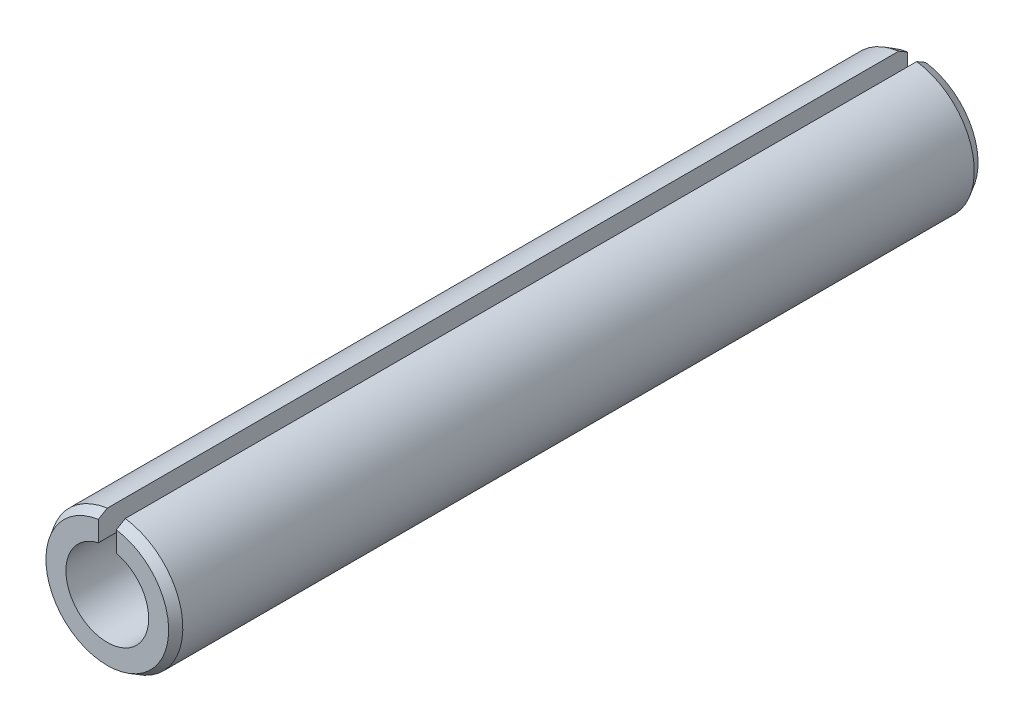
ISO-10303-21;
HEADER;
FILE_DESCRIPTION(('STEP AP214'),'2;1');
FILE_NAME('part.step','',(''),(''),'','','');
FILE_SCHEMA(('AUTOMOTIVE_DESIGN { 1 0 10303 214 1 1 1 1 }'));
ENDSEC;
DATA;
#1=APPLICATION_CONTEXT('core data for automotive mechanical design processes');
#2=APPLICATION_PROTOCOL_DEFINITION('international standard','automotive_design',2000,#1);
#3=PRODUCT_CONTEXT('',#1,'mechanical');
#4=PRODUCT('Part','Part','',(#3));
#5=PRODUCT_RELATED_PRODUCT_CATEGORY('part','',(#4));
#6=PRODUCT_DEFINITION_FORMATION('','',#4);
#7=PRODUCT_DEFINITION_CONTEXT('part definition',#1,'design');
#8=PRODUCT_DEFINITION('design','',#6,#7);
#9=PRODUCT_DEFINITION_SHAPE('','',#8);
#10=(LENGTH_UNIT() NAMED_UNIT(*) SI_UNIT(.MILLI.,.METRE.));
#11=(NAMED_UNIT(*) PLANE_ANGLE_UNIT() SI_UNIT($,.RADIAN.));
#12=(NAMED_UNIT(*) SI_UNIT($,.STERADIAN.) SOLID_ANGLE_UNIT());
#13=UNCERTAINTY_MEASURE_WITH_UNIT(LENGTH_MEASURE(1.E-05),#10,'distance_accuracy_value','');
#14=(GEOMETRIC_REPRESENTATION_CONTEXT(3) GLOBAL_UNCERTAINTY_ASSIGNED_CONTEXT((#13)) GLOBAL_UNIT_ASSIGNED_CONTEXT((#10,
#11,#12)) REPRESENTATION_CONTEXT('',''));
#15=CARTESIAN_POINT('',(0.,0.,0.));
#16=DIRECTION('',(0.,0.,1.));
#17=DIRECTION('',(1.,0.,0.));
#18=AXIS2_PLACEMENT_3D('',#15,#16,#17);
#19=CARTESIAN_POINT('',(0.,0.,45.));
#20=DIRECTION('',(0.,0.,-1.));
#21=DIRECTION('',(-1.,0.,0.));
#22=AXIS2_PLACEMENT_3D('',#19,#20,#21);
#23=CYLINDRICAL_SURFACE('',#22,2.3);
#24=CARTESIAN_POINT('',(0.,0.,0.));
#25=DIRECTION('',(0.,0.,-1.));
#26=DIRECTION('',(1.,0.,0.));
#27=AXIS2_PLACEMENT_3D('',#24,#25,#26);
#28=CIRCLE('',#27,2.3);
#29=CARTESIAN_POINT('',(0.499999999999999,2.24499443206436,0.));
#30=VERTEX_POINT('',#29);
#31=CARTESIAN_POINT('',(-0.5,2.24499443206436,0.));
#32=VERTEX_POINT('',#31);
#33=EDGE_CURVE('E89',#30,#32,#28,.T.);
#34=ORIENTED_EDGE('',*,*,#33,.T.);
#35=DIRECTION('',(0.,0.,-1.));
#36=VECTOR('',#35,1.);
#37=CARTESIAN_POINT('',(-0.5,2.24499443206436,45.));
#38=LINE('',#37,#36);
#39=CARTESIAN_POINT('',(-0.5,2.24499443206436,45.));
#40=VERTEX_POINT('',#39);
#41=EDGE_CURVE('E94',#40,#32,#38,.T.);
#42=ORIENTED_EDGE('',*,*,#41,.F.);
#43=CARTESIAN_POINT('',(0.,0.,45.));
#44=DIRECTION('',(0.,0.,-1.));
#45=DIRECTION('',(1.,0.,0.));
#46=AXIS2_PLACEMENT_3D('',#43,#44,#45);
#47=CIRCLE('',#46,2.3);
#48=CARTESIAN_POINT('',(0.499999999999999,2.24499443206436,45.));
#49=VERTEX_POINT('',#48);
#50=EDGE_CURVE('E109',#49,#40,#47,.T.);
#51=ORIENTED_EDGE('',*,*,#50,.F.);
#52=DIRECTION('',(0.,0.,-1.));
#53=VECTOR('',#52,1.);
#54=CARTESIAN_POINT('',(0.499999999999999,2.24499443206436,45.));
#55=LINE('',#54,#53);
#56=EDGE_CURVE('E105',#49,#30,#55,.T.);
#57=ORIENTED_EDGE('',*,*,#56,.T.);
#58=EDGE_LOOP('',(#34,#42,#51,#57));
#59=FACE_BOUND('',#58,.T.);
#60=ADVANCED_FACE('F33',(#59),#23,.F.);
#61=CARTESIAN_POINT('',(-0.5,3.66606055596467,45.));
#62=DIRECTION('',(-1.,0.,0.));
#63=DIRECTION('',(0.,-1.,0.));
#64=AXIS2_PLACEMENT_3D('',#61,#62,#63);
#65=PLANE('',#64);
#66=DIRECTION('',(0.,1.,0.));
#67=VECTOR('',#66,1.);
#68=CARTESIAN_POINT('',(-0.5,3.66606055596467,0.));
#69=LINE('',#68,#67);
#70=CARTESIAN_POINT('',(-0.5,3.37448326967725,0.));
#71=VERTEX_POINT('',#70);
#72=EDGE_CURVE('E85',#32,#71,#69,.T.);
#73=ORIENTED_EDGE('',*,*,#72,.T.);
#74=CARTESIAN_POINT('',(-0.5,3.37448326967725,0.));
#75=CARTESIAN_POINT('',(-0.5,3.42310923162932,0.0833159860457954));
#76=CARTESIAN_POINT('',(-0.5,3.47172031982738,0.166640645789255));
#77=CARTESIAN_POINT('',(-0.5,3.56891274858977,0.333307312455967));
#78=CARTESIAN_POINT('',(-0.5,3.61749408915419,0.416649319379174));
#79=CARTESIAN_POINT('',(-0.5,3.66606055596467,0.5));
#80=B_SPLINE_CURVE_WITH_KNOTS('',3,(#74,#75,#76,#77,#78,#79),.UNSPECIFIED.,.F.,.F.,(4,2,4),(0.,
0.289403405913722,0.578806811078924),.UNSPECIFIED.);
#81=CARTESIAN_POINT('',(-0.500000000000001,3.66606055596467,0.5));
#82=VERTEX_POINT('',#81);
#83=EDGE_CURVE('E40',#71,#82,#80,.T.);
#84=ORIENTED_EDGE('',*,*,#83,.T.);
#85=DIRECTION('',(0.,0.,-1.));
#86=VECTOR('',#85,1.);
#87=CARTESIAN_POINT('',(-0.500000000000001,3.66606055596467,45.));
#88=LINE('',#87,#86);
#89=CARTESIAN_POINT('',(-0.500000000000001,3.66606055596467,44.5));
#90=VERTEX_POINT('',#89);
#91=EDGE_CURVE('E101',#90,#82,#88,.T.);
#92=ORIENTED_EDGE('',*,*,#91,.F.);
#93=CARTESIAN_POINT('',(-0.500000000000001,3.66606055596467,44.5));
#94=CARTESIAN_POINT('',(-0.500000000000001,3.61749408915419,44.5833506806208));
#95=CARTESIAN_POINT('',(-0.500000000000001,3.56891274858977,44.666692687544));
#96=CARTESIAN_POINT('',(-0.5,3.47172031982738,44.8333593542107));
#97=CARTESIAN_POINT('',(-0.5,3.42310923162932,44.9166840139542));
#98=CARTESIAN_POINT('',(-0.5,3.37448326967725,45.));
#99=B_SPLINE_CURVE_WITH_KNOTS('',3,(#93,#94,#95,#96,#97,#98),.UNSPECIFIED.,.F.,.F.,(4,2,4),(0.,
0.289403405165202,0.578806811078924),.UNSPECIFIED.);
#100=CARTESIAN_POINT('',(-0.5,3.37448326967725,45.));
#101=VERTEX_POINT('',#100);
#102=EDGE_CURVE('E47',#90,#101,#99,.T.);
#103=ORIENTED_EDGE('',*,*,#102,.T.);
#104=DIRECTION('',(0.,1.,0.));
#105=VECTOR('',#104,1.);
#106=CARTESIAN_POINT('',(-0.5,3.66606055596467,45.));
#107=LINE('',#106,#105);
#108=EDGE_CURVE('E96',#40,#101,#107,.T.);
#109=ORIENTED_EDGE('',*,*,#108,.F.);
#110=ORIENTED_EDGE('',*,*,#41,.T.);
#111=EDGE_LOOP('',(#73,#84,#92,#103,#109,#110));
#112=FACE_BOUND('',#111,.T.);
#113=ADVANCED_FACE('F95',(#112),#65,.F.);
#114=CARTESIAN_POINT('',(0.,0.,45.));
#115=DIRECTION('',(0.,0.,-1.));
#116=DIRECTION('',(-1.,0.,0.));
#117=AXIS2_PLACEMENT_3D('',#114,#115,#116);
#118=CYLINDRICAL_SURFACE('',#117,3.7);
#119=ORIENTED_EDGE('',*,*,#91,.T.);
#120=CARTESIAN_POINT('',(0.,0.,0.5));
#121=DIRECTION('',(0.,0.,1.));
#122=DIRECTION('',(1.,0.,0.));
#123=AXIS2_PLACEMENT_3D('',#120,#121,#122);
#124=CIRCLE('',#123,3.7);
#125=CARTESIAN_POINT('',(0.499999999999999,3.66606055596467,0.5));
#126=VERTEX_POINT('',#125);
#127=EDGE_CURVE('E121',#82,#126,#124,.T.);
#128=ORIENTED_EDGE('',*,*,#127,.T.);
#129=DIRECTION('',(0.,0.,-1.));
#130=VECTOR('',#129,1.);
#131=CARTESIAN_POINT('',(0.499999999999999,3.66606055596467,45.));
#132=LINE('',#131,#130);
#133=CARTESIAN_POINT('',(0.499999999999999,3.66606055596467,44.5));
#134=VERTEX_POINT('',#133);
#135=EDGE_CURVE('E115',#134,#126,#132,.T.);
#136=ORIENTED_EDGE('',*,*,#135,.F.);
#137=CARTESIAN_POINT('',(0.,0.,44.5));
#138=DIRECTION('',(0.,0.,1.));
#139=DIRECTION('',(1.,0.,0.));
#140=AXIS2_PLACEMENT_3D('',#137,#138,#139);
#141=CIRCLE('',#140,3.7);
#142=EDGE_CURVE('E100',#134,#90,#141,.F.);
#143=ORIENTED_EDGE('',*,*,#142,.T.);
#144=EDGE_LOOP('',(#119,#128,#136,#143));
#145=FACE_BOUND('',#144,.T.);
#146=ADVANCED_FACE('F145',(#145),#118,.T.);
#147=CARTESIAN_POINT('',(0.499999999999999,3.66606055596467,45.));
#148=DIRECTION('',(1.,0.,0.));
#149=DIRECTION('',(0.,1.,0.));
#150=AXIS2_PLACEMENT_3D('',#147,#148,#149);
#151=PLANE('',#150);
#152=ORIENTED_EDGE('',*,*,#135,.T.);
#153=CARTESIAN_POINT('',(0.499999999999999,3.66606055596467,0.5));
#154=CARTESIAN_POINT('',(0.499999999999999,3.61749408915419,0.416649319379174));
#155=CARTESIAN_POINT('',(0.499999999999999,3.56891274858977,0.333307312455967));
#156=CARTESIAN_POINT('',(0.499999999999999,3.47172031982738,0.166640645789255));
#157=CARTESIAN_POINT('',(0.499999999999999,3.42310923162932,0.0833159860457955));
#158=CARTESIAN_POINT('',(0.499999999999999,3.37448326967725,0.));
#159=B_SPLINE_CURVE_WITH_KNOTS('',3,(#153,#154,#155,#156,#157,#158),.UNSPECIFIED.,.F.,.F.,(4,2,
4),(0.,0.289403405165202,0.578806811078924),.UNSPECIFIED.);
#160=CARTESIAN_POINT('',(0.499999999999999,3.37448326967725,0.));
#161=VERTEX_POINT('',#160);
#162=EDGE_CURVE('E131',#126,#161,#159,.T.);
#163=ORIENTED_EDGE('',*,*,#162,.T.);
#164=DIRECTION('',(0.,-1.,0.));
#165=VECTOR('',#164,1.);
#166=CARTESIAN_POINT('',(0.499999999999999,3.66606055596467,0.));
#167=LINE('',#166,#165);
#168=EDGE_CURVE('E91',#161,#30,#167,.T.);
#169=ORIENTED_EDGE('',*,*,#168,.T.);
#170=ORIENTED_EDGE('',*,*,#56,.F.);
#171=DIRECTION('',(0.,-1.,0.));
#172=VECTOR('',#171,1.);
#173=CARTESIAN_POINT('',(0.499999999999999,3.66606055596467,45.));
#174=LINE('',#173,#172);
#175=CARTESIAN_POINT('',(0.499999999999999,3.37448326967725,45.));
#176=VERTEX_POINT('',#175);
#177=EDGE_CURVE('E112',#176,#49,#174,.T.);
#178=ORIENTED_EDGE('',*,*,#177,.F.);
#179=CARTESIAN_POINT('',(0.5,3.37448326967725,45.));
#180=CARTESIAN_POINT('',(0.499999999999999,3.42310923162932,44.9166840139542));
#181=CARTESIAN_POINT('',(0.499999999999999,3.47172031982738,44.8333593542107));
#182=CARTESIAN_POINT('',(0.499999999999999,3.56891274858977,44.666692687544));
#183=CARTESIAN_POINT('',(0.499999999999999,3.61749408915419,44.5833506806208));
#184=CARTESIAN_POINT('',(0.499999999999999,3.66606055596467,44.5));
#185=B_SPLINE_CURVE_WITH_KNOTS('',3,(#179,#180,#181,#182,#183,#184),.UNSPECIFIED.,.F.,.F.,(4,2,
4),(0.,0.289403405913721,0.578806811078925),.UNSPECIFIED.);
#186=EDGE_CURVE('E124',#176,#134,#185,.T.);
#187=ORIENTED_EDGE('',*,*,#186,.T.);
#188=EDGE_LOOP('',(#152,#163,#169,#170,#178,#187));
#189=FACE_BOUND('',#188,.T.);
#190=ADVANCED_FACE('F139',(#189),#151,.F.);
#191=CARTESIAN_POINT('',(0.,0.,45.));
#192=DIRECTION('',(0.,0.,1.));
#193=DIRECTION('',(1.,0.,0.));
#194=AXIS2_PLACEMENT_3D('',#191,#192,#193);
#195=PLANE('',#194);
#196=ORIENTED_EDGE('',*,*,#108,.T.);
#197=CARTESIAN_POINT('',(0.,0.,45.));
#198=DIRECTION('',(0.,0.,1.));
#199=DIRECTION('',(1.,0.,0.));
#200=AXIS2_PLACEMENT_3D('',#197,#198,#199);
#201=CIRCLE('',#200,3.41132486540518);
#202=EDGE_CURVE('E11',#101,#176,#201,.T.);
#203=ORIENTED_EDGE('',*,*,#202,.T.);
#204=ORIENTED_EDGE('',*,*,#177,.T.);
#205=ORIENTED_EDGE('',*,*,#50,.T.);
#206=EDGE_LOOP('',(#196,#203,#204,#205));
#207=FACE_BOUND('',#206,.T.);
#208=ADVANCED_FACE('F144',(#207),#195,.T.);
#209=CARTESIAN_POINT('',(0.,0.,0.));
#210=DIRECTION('',(0.,0.,1.));
#211=DIRECTION('',(1.,0.,0.));
#212=AXIS2_PLACEMENT_3D('',#209,#210,#211);
#213=PLANE('',#212);
#214=ORIENTED_EDGE('',*,*,#168,.F.);
#215=CARTESIAN_POINT('',(0.,0.,0.));
#216=DIRECTION('',(0.,0.,1.));
#217=DIRECTION('',(1.,0.,0.));
#218=AXIS2_PLACEMENT_3D('',#215,#216,#217);
#219=CIRCLE('',#218,3.41132486540518);
#220=EDGE_CURVE('E55',#161,#71,#219,.F.);
#221=ORIENTED_EDGE('',*,*,#220,.T.);
#222=ORIENTED_EDGE('',*,*,#72,.F.);
#223=ORIENTED_EDGE('',*,*,#33,.F.);
#224=EDGE_LOOP('',(#214,#221,#222,#223));
#225=FACE_BOUND('',#224,.T.);
#226=ADVANCED_FACE('F87',(#225),#213,.F.);
#227=CARTESIAN_POINT('',(0.,0.,0.5));
#228=DIRECTION('',(0.,0.,1.));
#229=DIRECTION('',(1.,0.,0.));
#230=AXIS2_PLACEMENT_3D('',#227,#228,#229);
#231=CONICAL_SURFACE('',#230,3.7,0.523598775598307);
#232=ORIENTED_EDGE('',*,*,#83,.F.);
#233=ORIENTED_EDGE('',*,*,#220,.F.);
#234=ORIENTED_EDGE('',*,*,#162,.F.);
#235=ORIENTED_EDGE('',*,*,#127,.F.);
#236=EDGE_LOOP('',(#232,#233,#234,#235));
#237=FACE_BOUND('',#236,.T.);
#238=ADVANCED_FACE('F161',(#237),#231,.T.);
#239=CARTESIAN_POINT('',(0.,0.,45.));
#240=DIRECTION('',(0.,0.,-1.));
#241=DIRECTION('',(-1.,0.,0.));
#242=AXIS2_PLACEMENT_3D('',#239,#240,#241);
#243=CONICAL_SURFACE('',#242,3.41132486540518,0.523598775598307);
#244=ORIENTED_EDGE('',*,*,#102,.F.);
#245=ORIENTED_EDGE('',*,*,#142,.F.);
#246=ORIENTED_EDGE('',*,*,#186,.F.);
#247=ORIENTED_EDGE('',*,*,#202,.F.);
#248=EDGE_LOOP('',(#244,#245,#246,#247));
#249=FACE_BOUND('',#248,.T.);
#250=ADVANCED_FACE('F137',(#249),#243,.T.);
#251=CLOSED_SHELL('',(#60,#113,#146,#190,#208,#226,#238,#250));
#252=MANIFOLD_SOLID_BREP('B2',#251);
#253=ADVANCED_BREP_SHAPE_REPRESENTATION('',(#18,#252),#14);
#254=SHAPE_DEFINITION_REPRESENTATION(#9,#253);
ENDSEC;
END-ISO-10303-21;
